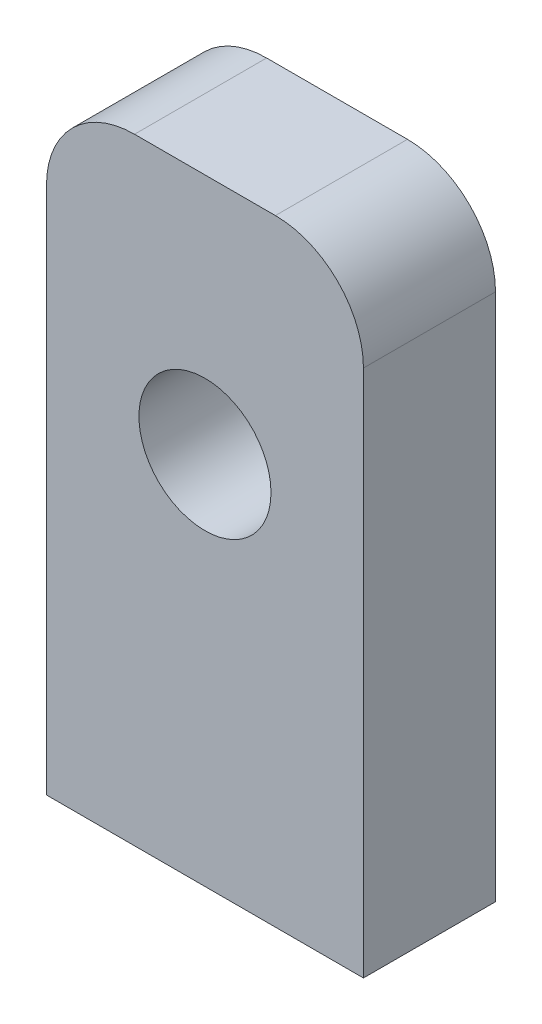
ISO-10303-21;
HEADER;
FILE_DESCRIPTION(('STEP AP214'),'2;1');
FILE_NAME('part.step','',(''),(''),'','','');
FILE_SCHEMA(('AUTOMOTIVE_DESIGN { 1 0 10303 214 1 1 1 1 }'));
ENDSEC;
DATA;
#1=APPLICATION_CONTEXT('core data for automotive mechanical design processes');
#2=APPLICATION_PROTOCOL_DEFINITION('international standard','automotive_design',2000,#1);
#3=PRODUCT_CONTEXT('',#1,'mechanical');
#4=PRODUCT('Part','Part','',(#3));
#5=PRODUCT_RELATED_PRODUCT_CATEGORY('part','',(#4));
#6=PRODUCT_DEFINITION_FORMATION('','',#4);
#7=PRODUCT_DEFINITION_CONTEXT('part definition',#1,'design');
#8=PRODUCT_DEFINITION('design','',#6,#7);
#9=PRODUCT_DEFINITION_SHAPE('','',#8);
#10=(LENGTH_UNIT() NAMED_UNIT(*) SI_UNIT(.MILLI.,.METRE.));
#11=(NAMED_UNIT(*) PLANE_ANGLE_UNIT() SI_UNIT($,.RADIAN.));
#12=(NAMED_UNIT(*) SI_UNIT($,.STERADIAN.) SOLID_ANGLE_UNIT());
#13=UNCERTAINTY_MEASURE_WITH_UNIT(LENGTH_MEASURE(1.E-05),#10,'distance_accuracy_value','');
#14=(GEOMETRIC_REPRESENTATION_CONTEXT(3) GLOBAL_UNCERTAINTY_ASSIGNED_CONTEXT((#13)) GLOBAL_UNIT_ASSIGNED_CONTEXT((#10,
#11,#12)) REPRESENTATION_CONTEXT('',''));
#15=CARTESIAN_POINT('',(0.,0.,0.));
#16=DIRECTION('',(0.,0.,1.));
#17=DIRECTION('',(1.,0.,0.));
#18=AXIS2_PLACEMENT_3D('',#15,#16,#17);
#19=CARTESIAN_POINT('',(0.,0.,3.));
#20=DIRECTION('',(0.,0.,-1.));
#21=DIRECTION('',(-1.,0.,0.));
#22=AXIS2_PLACEMENT_3D('',#19,#20,#21);
#23=PLANE('',#22);
#24=DIRECTION('',(-1.,0.,0.));
#25=VECTOR('',#24,1.);
#26=CARTESIAN_POINT('',(0.,14.,3.));
#27=LINE('',#26,#25);
#28=CARTESIAN_POINT('',(5.2,14.,3.));
#29=VERTEX_POINT('',#28);
#30=CARTESIAN_POINT('',(2.,14.,3.));
#31=VERTEX_POINT('',#30);
#32=EDGE_CURVE('E133',#29,#31,#27,.T.);
#33=ORIENTED_EDGE('',*,*,#32,.T.);
#34=CARTESIAN_POINT('',(2.,12.,3.));
#35=DIRECTION('',(0.,0.,-1.));
#36=DIRECTION('',(-1.,0.,0.));
#37=AXIS2_PLACEMENT_3D('',#34,#35,#36);
#38=CIRCLE('',#37,2.);
#39=CARTESIAN_POINT('',(0.,12.,3.));
#40=VERTEX_POINT('',#39);
#41=EDGE_CURVE('E54',#31,#40,#38,.F.);
#42=ORIENTED_EDGE('',*,*,#41,.T.);
#43=DIRECTION('',(0.,-1.,0.));
#44=VECTOR('',#43,1.);
#45=CARTESIAN_POINT('',(0.,0.,3.));
#46=LINE('',#45,#44);
#47=CARTESIAN_POINT('',(0.,0.,3.));
#48=VERTEX_POINT('',#47);
#49=EDGE_CURVE('E100',#40,#48,#46,.T.);
#50=ORIENTED_EDGE('',*,*,#49,.T.);
#51=DIRECTION('',(1.,0.,0.));
#52=VECTOR('',#51,1.);
#53=CARTESIAN_POINT('',(0.,0.,3.));
#54=LINE('',#53,#52);
#55=CARTESIAN_POINT('',(7.2,0.,3.));
#56=VERTEX_POINT('',#55);
#57=EDGE_CURVE('E103',#48,#56,#54,.T.);
#58=ORIENTED_EDGE('',*,*,#57,.T.);
#59=DIRECTION('',(0.,1.,0.));
#60=VECTOR('',#59,1.);
#61=CARTESIAN_POINT('',(7.2,0.,3.));
#62=LINE('',#61,#60);
#63=CARTESIAN_POINT('',(7.2,12.,3.));
#64=VERTEX_POINT('',#63);
#65=EDGE_CURVE('E120',#56,#64,#62,.T.);
#66=ORIENTED_EDGE('',*,*,#65,.T.);
#67=CARTESIAN_POINT('',(5.2,12.,3.));
#68=DIRECTION('',(0.,0.,-1.));
#69=DIRECTION('',(-1.,0.,0.));
#70=AXIS2_PLACEMENT_3D('',#67,#68,#69);
#71=CIRCLE('',#70,2.);
#72=EDGE_CURVE('E148',#64,#29,#71,.F.);
#73=ORIENTED_EDGE('',*,*,#72,.T.);
#74=EDGE_LOOP('',(#33,#42,#50,#58,#66,#73));
#75=FACE_BOUND('',#74,.T.);
#76=CARTESIAN_POINT('',(3.6,8.5,3.));
#77=DIRECTION('',(0.,0.,1.));
#78=DIRECTION('',(1.,0.,0.));
#79=AXIS2_PLACEMENT_3D('',#76,#77,#78);
#80=CIRCLE('',#79,1.5);
#81=CARTESIAN_POINT('',(5.1,8.5,3.));
#82=VERTEX_POINT('',#81);
#83=EDGE_CURVE('E172',#82,#82,#80,.T.);
#84=ORIENTED_EDGE('',*,*,#83,.F.);
#85=EDGE_LOOP('',(#84));
#86=FACE_BOUND('',#85,.T.);
#87=ADVANCED_FACE('F45',(#75,#86),#23,.F.);
#88=CARTESIAN_POINT('',(0.,0.,0.));
#89=DIRECTION('',(0.,0.,-1.));
#90=DIRECTION('',(-1.,0.,0.));
#91=AXIS2_PLACEMENT_3D('',#88,#89,#90);
#92=PLANE('',#91);
#93=DIRECTION('',(0.,-1.,0.));
#94=VECTOR('',#93,1.);
#95=CARTESIAN_POINT('',(0.,0.,0.));
#96=LINE('',#95,#94);
#97=CARTESIAN_POINT('',(0.,12.,0.));
#98=VERTEX_POINT('',#97);
#99=CARTESIAN_POINT('',(0.,0.,0.));
#100=VERTEX_POINT('',#99);
#101=EDGE_CURVE('E124',#98,#100,#96,.T.);
#102=ORIENTED_EDGE('',*,*,#101,.F.);
#103=CARTESIAN_POINT('',(2.,12.,0.));
#104=DIRECTION('',(0.,0.,-1.));
#105=DIRECTION('',(-1.,0.,0.));
#106=AXIS2_PLACEMENT_3D('',#103,#104,#105);
#107=CIRCLE('',#106,2.);
#108=CARTESIAN_POINT('',(2.,14.,0.));
#109=VERTEX_POINT('',#108);
#110=EDGE_CURVE('E139',#98,#109,#107,.T.);
#111=ORIENTED_EDGE('',*,*,#110,.T.);
#112=DIRECTION('',(-1.,0.,0.));
#113=VECTOR('',#112,1.);
#114=CARTESIAN_POINT('',(0.,14.,0.));
#115=LINE('',#114,#113);
#116=CARTESIAN_POINT('',(5.2,14.,0.));
#117=VERTEX_POINT('',#116);
#118=EDGE_CURVE('E111',#117,#109,#115,.T.);
#119=ORIENTED_EDGE('',*,*,#118,.F.);
#120=CARTESIAN_POINT('',(5.2,12.,0.));
#121=DIRECTION('',(0.,0.,-1.));
#122=DIRECTION('',(-1.,0.,0.));
#123=AXIS2_PLACEMENT_3D('',#120,#121,#122);
#124=CIRCLE('',#123,2.);
#125=CARTESIAN_POINT('',(7.2,12.,0.));
#126=VERTEX_POINT('',#125);
#127=EDGE_CURVE('E131',#117,#126,#124,.T.);
#128=ORIENTED_EDGE('',*,*,#127,.T.);
#129=DIRECTION('',(0.,1.,0.));
#130=VECTOR('',#129,1.);
#131=CARTESIAN_POINT('',(7.2,0.,0.));
#132=LINE('',#131,#130);
#133=CARTESIAN_POINT('',(7.2,0.,0.));
#134=VERTEX_POINT('',#133);
#135=EDGE_CURVE('E162',#134,#126,#132,.T.);
#136=ORIENTED_EDGE('',*,*,#135,.F.);
#137=DIRECTION('',(1.,0.,0.));
#138=VECTOR('',#137,1.);
#139=CARTESIAN_POINT('',(0.,0.,0.));
#140=LINE('',#139,#138);
#141=EDGE_CURVE('E165',#100,#134,#140,.T.);
#142=ORIENTED_EDGE('',*,*,#141,.F.);
#143=EDGE_LOOP('',(#102,#111,#119,#128,#136,#142));
#144=FACE_BOUND('',#143,.T.);
#145=CARTESIAN_POINT('',(3.6,8.5,0.));
#146=DIRECTION('',(0.,0.,1.));
#147=DIRECTION('',(1.,0.,0.));
#148=AXIS2_PLACEMENT_3D('',#145,#146,#147);
#149=CIRCLE('',#148,1.5);
#150=CARTESIAN_POINT('',(5.1,8.5,0.));
#151=VERTEX_POINT('',#150);
#152=EDGE_CURVE('E176',#151,#151,#149,.T.);
#153=ORIENTED_EDGE('',*,*,#152,.T.);
#154=EDGE_LOOP('',(#153));
#155=FACE_BOUND('',#154,.T.);
#156=ADVANCED_FACE('F160',(#144,#155),#92,.T.);
#157=CARTESIAN_POINT('',(0.,0.,3.));
#158=DIRECTION('',(1.,0.,0.));
#159=DIRECTION('',(0.,0.,-1.));
#160=AXIS2_PLACEMENT_3D('',#157,#158,#159);
#161=PLANE('',#160);
#162=ORIENTED_EDGE('',*,*,#49,.F.);
#163=DIRECTION('',(0.,0.,-1.));
#164=VECTOR('',#163,1.);
#165=CARTESIAN_POINT('',(0.,12.,3.));
#166=LINE('',#165,#164);
#167=EDGE_CURVE('E127',#40,#98,#166,.T.);
#168=ORIENTED_EDGE('',*,*,#167,.T.);
#169=ORIENTED_EDGE('',*,*,#101,.T.);
#170=DIRECTION('',(0.,0.,-1.));
#171=VECTOR('',#170,1.);
#172=CARTESIAN_POINT('',(0.,0.,3.));
#173=LINE('',#172,#171);
#174=EDGE_CURVE('E116',#48,#100,#173,.T.);
#175=ORIENTED_EDGE('',*,*,#174,.F.);
#176=EDGE_LOOP('',(#162,#168,#169,#175));
#177=FACE_BOUND('',#176,.T.);
#178=ADVANCED_FACE('F122',(#177),#161,.F.);
#179=CARTESIAN_POINT('',(0.,0.,3.));
#180=DIRECTION('',(0.,1.,0.));
#181=DIRECTION('',(0.,0.,1.));
#182=AXIS2_PLACEMENT_3D('',#179,#180,#181);
#183=PLANE('',#182);
#184=ORIENTED_EDGE('',*,*,#141,.T.);
#185=DIRECTION('',(0.,0.,-1.));
#186=VECTOR('',#185,1.);
#187=CARTESIAN_POINT('',(7.2,0.,3.));
#188=LINE('',#187,#186);
#189=EDGE_CURVE('E118',#56,#134,#188,.T.);
#190=ORIENTED_EDGE('',*,*,#189,.F.);
#191=ORIENTED_EDGE('',*,*,#57,.F.);
#192=ORIENTED_EDGE('',*,*,#174,.T.);
#193=EDGE_LOOP('',(#184,#190,#191,#192));
#194=FACE_BOUND('',#193,.T.);
#195=ADVANCED_FACE('F115',(#194),#183,.F.);
#196=CARTESIAN_POINT('',(7.2,0.,3.));
#197=DIRECTION('',(-1.,0.,0.));
#198=DIRECTION('',(0.,0.,1.));
#199=AXIS2_PLACEMENT_3D('',#196,#197,#198);
#200=PLANE('',#199);
#201=ORIENTED_EDGE('',*,*,#135,.T.);
#202=DIRECTION('',(0.,0.,-1.));
#203=VECTOR('',#202,1.);
#204=CARTESIAN_POINT('',(7.2,12.,3.));
#205=LINE('',#204,#203);
#206=EDGE_CURVE('E11',#126,#64,#205,.F.);
#207=ORIENTED_EDGE('',*,*,#206,.T.);
#208=ORIENTED_EDGE('',*,*,#65,.F.);
#209=ORIENTED_EDGE('',*,*,#189,.T.);
#210=EDGE_LOOP('',(#201,#207,#208,#209));
#211=FACE_BOUND('',#210,.T.);
#212=ADVANCED_FACE('F163',(#211),#200,.F.);
#213=CARTESIAN_POINT('',(0.,14.,3.));
#214=DIRECTION('',(0.,-1.,0.));
#215=DIRECTION('',(0.,0.,-1.));
#216=AXIS2_PLACEMENT_3D('',#213,#214,#215);
#217=PLANE('',#216);
#218=ORIENTED_EDGE('',*,*,#118,.T.);
#219=DIRECTION('',(0.,0.,-1.));
#220=VECTOR('',#219,1.);
#221=CARTESIAN_POINT('',(2.,14.,3.));
#222=LINE('',#221,#220);
#223=EDGE_CURVE('E67',#109,#31,#222,.F.);
#224=ORIENTED_EDGE('',*,*,#223,.T.);
#225=ORIENTED_EDGE('',*,*,#32,.F.);
#226=DIRECTION('',(0.,0.,-1.));
#227=VECTOR('',#226,1.);
#228=CARTESIAN_POINT('',(5.2,14.,3.));
#229=LINE('',#228,#227);
#230=EDGE_CURVE('E142',#29,#117,#229,.T.);
#231=ORIENTED_EDGE('',*,*,#230,.T.);
#232=EDGE_LOOP('',(#218,#224,#225,#231));
#233=FACE_BOUND('',#232,.T.);
#234=ADVANCED_FACE('F154',(#233),#217,.F.);
#235=CARTESIAN_POINT('',(3.6,8.5,3.));
#236=DIRECTION('',(0.,0.,-1.));
#237=DIRECTION('',(-1.,0.,0.));
#238=AXIS2_PLACEMENT_3D('',#235,#236,#237);
#239=CYLINDRICAL_SURFACE('',#238,1.5);
#240=ORIENTED_EDGE('',*,*,#83,.T.);
#241=EDGE_LOOP('',(#240));
#242=FACE_BOUND('',#241,.T.);
#243=ORIENTED_EDGE('',*,*,#152,.F.);
#244=EDGE_LOOP('',(#243));
#245=FACE_BOUND('',#244,.T.);
#246=ADVANCED_FACE('F184',(#242,#245),#239,.F.);
#247=CARTESIAN_POINT('',(2.,12.,3.));
#248=DIRECTION('',(0.,0.,-1.));
#249=DIRECTION('',(-1.,0.,0.));
#250=AXIS2_PLACEMENT_3D('',#247,#248,#249);
#251=CYLINDRICAL_SURFACE('',#250,2.);
#252=ORIENTED_EDGE('',*,*,#41,.F.);
#253=ORIENTED_EDGE('',*,*,#223,.F.);
#254=ORIENTED_EDGE('',*,*,#110,.F.);
#255=ORIENTED_EDGE('',*,*,#167,.F.);
#256=EDGE_LOOP('',(#252,#253,#254,#255));
#257=FACE_BOUND('',#256,.T.);
#258=ADVANCED_FACE('F201',(#257),#251,.T.);
#259=CARTESIAN_POINT('',(5.2,12.,3.));
#260=DIRECTION('',(0.,0.,-1.));
#261=DIRECTION('',(-1.,0.,0.));
#262=AXIS2_PLACEMENT_3D('',#259,#260,#261);
#263=CYLINDRICAL_SURFACE('',#262,2.);
#264=ORIENTED_EDGE('',*,*,#72,.F.);
#265=ORIENTED_EDGE('',*,*,#206,.F.);
#266=ORIENTED_EDGE('',*,*,#127,.F.);
#267=ORIENTED_EDGE('',*,*,#230,.F.);
#268=EDGE_LOOP('',(#264,#265,#266,#267));
#269=FACE_BOUND('',#268,.T.);
#270=ADVANCED_FACE('F47',(#269),#263,.T.);
#271=CLOSED_SHELL('',(#87,#156,#178,#195,#212,#234,#246,#258,#270));
#272=MANIFOLD_SOLID_BREP('B2',#271);
#273=ADVANCED_BREP_SHAPE_REPRESENTATION('',(#18,#272),#14);
#274=SHAPE_DEFINITION_REPRESENTATION(#9,#273);
ENDSEC;
END-ISO-10303-21;
